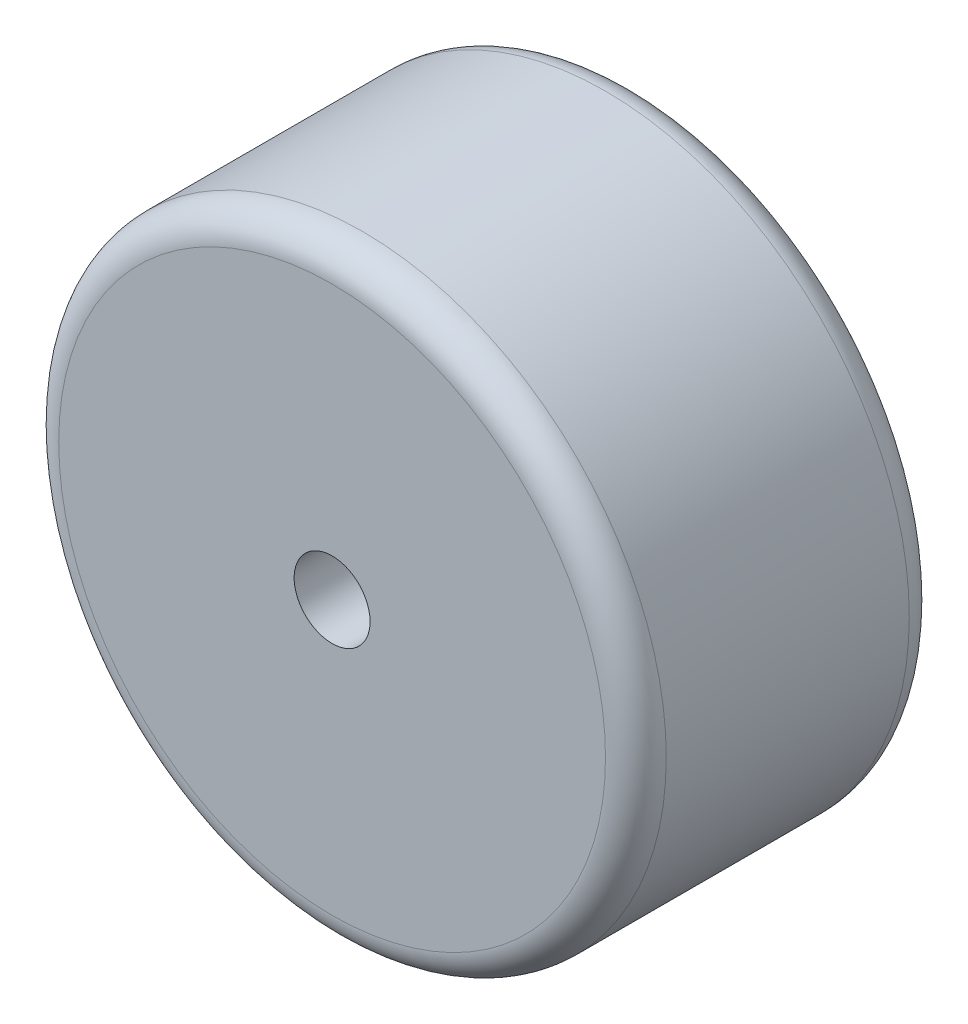
ISO-10303-21;
HEADER;
FILE_DESCRIPTION(('STEP AP214'),'2;1');
FILE_NAME('part.step','',(''),(''),'','','');
FILE_SCHEMA(('AUTOMOTIVE_DESIGN { 1 0 10303 214 1 1 1 1 }'));
ENDSEC;
DATA;
#1=APPLICATION_CONTEXT('core data for automotive mechanical design processes');
#2=APPLICATION_PROTOCOL_DEFINITION('international standard','automotive_design',2000,#1);
#3=PRODUCT_CONTEXT('',#1,'mechanical');
#4=PRODUCT('Part','Part','',(#3));
#5=PRODUCT_RELATED_PRODUCT_CATEGORY('part','',(#4));
#6=PRODUCT_DEFINITION_FORMATION('','',#4);
#7=PRODUCT_DEFINITION_CONTEXT('part definition',#1,'design');
#8=PRODUCT_DEFINITION('design','',#6,#7);
#9=PRODUCT_DEFINITION_SHAPE('','',#8);
#10=(LENGTH_UNIT() NAMED_UNIT(*) SI_UNIT(.MILLI.,.METRE.));
#11=(NAMED_UNIT(*) PLANE_ANGLE_UNIT() SI_UNIT($,.RADIAN.));
#12=(NAMED_UNIT(*) SI_UNIT($,.STERADIAN.) SOLID_ANGLE_UNIT());
#13=UNCERTAINTY_MEASURE_WITH_UNIT(LENGTH_MEASURE(1.E-05),#10,'distance_accuracy_value','');
#14=(GEOMETRIC_REPRESENTATION_CONTEXT(3) GLOBAL_UNCERTAINTY_ASSIGNED_CONTEXT((#13)) GLOBAL_UNIT_ASSIGNED_CONTEXT((#10,
#11,#12)) REPRESENTATION_CONTEXT('',''));
#15=CARTESIAN_POINT('',(0.,0.,0.));
#16=DIRECTION('',(0.,0.,1.));
#17=DIRECTION('',(1.,0.,0.));
#18=AXIS2_PLACEMENT_3D('',#15,#16,#17);
#19=CARTESIAN_POINT('',(0.,0.,25.4));
#20=DIRECTION('',(0.,0.,-1.));
#21=DIRECTION('',(-1.,0.,0.));
#22=AXIS2_PLACEMENT_3D('',#19,#20,#21);
#23=CYLINDRICAL_SURFACE('',#22,25.4);
#24=CARTESIAN_POINT('',(0.,0.,2.54));
#25=DIRECTION('',(0.,0.,1.));
#26=DIRECTION('',(1.,0.,0.));
#27=AXIS2_PLACEMENT_3D('',#24,#25,#26);
#28=CIRCLE('',#27,25.4);
#29=CARTESIAN_POINT('',(25.4,0.,2.54));
#30=VERTEX_POINT('',#29);
#31=EDGE_CURVE('E41',#30,#30,#28,.T.);
#32=ORIENTED_EDGE('',*,*,#31,.T.);
#33=EDGE_LOOP('',(#32));
#34=FACE_BOUND('',#33,.T.);
#35=CARTESIAN_POINT('',(0.,0.,22.86));
#36=DIRECTION('',(0.,0.,1.));
#37=DIRECTION('',(1.,0.,0.));
#38=AXIS2_PLACEMENT_3D('',#35,#36,#37);
#39=CIRCLE('',#38,25.4);
#40=CARTESIAN_POINT('',(25.4,0.,22.86));
#41=VERTEX_POINT('',#40);
#42=EDGE_CURVE('E45',#41,#41,#39,.F.);
#43=ORIENTED_EDGE('',*,*,#42,.T.);
#44=EDGE_LOOP('',(#43));
#45=FACE_BOUND('',#44,.T.);
#46=ADVANCED_FACE('F30',(#34,#45),#23,.T.);
#47=CARTESIAN_POINT('',(0.,0.,25.4));
#48=DIRECTION('',(0.,0.,1.));
#49=DIRECTION('',(1.,0.,0.));
#50=AXIS2_PLACEMENT_3D('',#47,#48,#49);
#51=PLANE('',#50);
#52=CARTESIAN_POINT('',(0.,0.,25.4));
#53=DIRECTION('',(0.,0.,1.));
#54=DIRECTION('',(1.,0.,0.));
#55=AXIS2_PLACEMENT_3D('',#52,#53,#54);
#56=CIRCLE('',#55,3.175);
#57=CARTESIAN_POINT('',(3.175,0.,25.4));
#58=VERTEX_POINT('',#57);
#59=EDGE_CURVE('E53',#58,#58,#56,.T.);
#60=ORIENTED_EDGE('',*,*,#59,.F.);
#61=EDGE_LOOP('',(#60));
#62=FACE_BOUND('',#61,.T.);
#63=CARTESIAN_POINT('',(0.,0.,25.4));
#64=DIRECTION('',(0.,0.,1.));
#65=DIRECTION('',(1.,0.,0.));
#66=AXIS2_PLACEMENT_3D('',#63,#64,#65);
#67=CIRCLE('',#66,22.86);
#68=CARTESIAN_POINT('',(22.86,0.,25.4));
#69=VERTEX_POINT('',#68);
#70=EDGE_CURVE('E10',#69,#69,#67,.T.);
#71=ORIENTED_EDGE('',*,*,#70,.T.);
#72=EDGE_LOOP('',(#71));
#73=FACE_BOUND('',#72,.T.);
#74=ADVANCED_FACE('F60',(#62,#73),#51,.T.);
#75=CARTESIAN_POINT('',(0.,0.,0.));
#76=DIRECTION('',(0.,0.,1.));
#77=DIRECTION('',(1.,0.,0.));
#78=AXIS2_PLACEMENT_3D('',#75,#76,#77);
#79=PLANE('',#78);
#80=CARTESIAN_POINT('',(0.,0.,0.));
#81=DIRECTION('',(0.,0.,1.));
#82=DIRECTION('',(1.,0.,0.));
#83=AXIS2_PLACEMENT_3D('',#80,#81,#82);
#84=CIRCLE('',#83,3.175);
#85=CARTESIAN_POINT('',(3.175,0.,0.));
#86=VERTEX_POINT('',#85);
#87=EDGE_CURVE('E50',#86,#86,#84,.F.);
#88=ORIENTED_EDGE('',*,*,#87,.F.);
#89=EDGE_LOOP('',(#88));
#90=FACE_BOUND('',#89,.T.);
#91=CARTESIAN_POINT('',(0.,0.,0.));
#92=DIRECTION('',(0.,0.,1.));
#93=DIRECTION('',(1.,0.,0.));
#94=AXIS2_PLACEMENT_3D('',#91,#92,#93);
#95=CIRCLE('',#94,22.86);
#96=CARTESIAN_POINT('',(22.86,0.,0.));
#97=VERTEX_POINT('',#96);
#98=EDGE_CURVE('E37',#97,#97,#95,.F.);
#99=ORIENTED_EDGE('',*,*,#98,.T.);
#100=EDGE_LOOP('',(#99));
#101=FACE_BOUND('',#100,.T.);
#102=ADVANCED_FACE('F62',(#90,#101),#79,.F.);
#103=CARTESIAN_POINT('',(0.,0.,2.54));
#104=DIRECTION('',(0.,0.,1.));
#105=DIRECTION('',(1.,0.,0.));
#106=AXIS2_PLACEMENT_3D('',#103,#104,#105);
#107=TOROIDAL_SURFACE('',#106,22.86,2.54);
#108=ORIENTED_EDGE('',*,*,#98,.F.);
#109=EDGE_LOOP('',(#108));
#110=FACE_BOUND('',#109,.T.);
#111=ORIENTED_EDGE('',*,*,#31,.F.);
#112=EDGE_LOOP('',(#111));
#113=FACE_BOUND('',#112,.T.);
#114=ADVANCED_FACE('F68',(#110,#113),#107,.T.);
#115=CARTESIAN_POINT('',(0.,0.,22.86));
#116=DIRECTION('',(0.,0.,1.));
#117=DIRECTION('',(1.,0.,0.));
#118=AXIS2_PLACEMENT_3D('',#115,#116,#117);
#119=TOROIDAL_SURFACE('',#118,22.86,2.54);
#120=ORIENTED_EDGE('',*,*,#42,.F.);
#121=EDGE_LOOP('',(#120));
#122=FACE_BOUND('',#121,.T.);
#123=ORIENTED_EDGE('',*,*,#70,.F.);
#124=EDGE_LOOP('',(#123));
#125=FACE_BOUND('',#124,.T.);
#126=ADVANCED_FACE('F32',(#122,#125),#119,.T.);
#127=CARTESIAN_POINT('',(0.,0.,-0.001000000000001));
#128=DIRECTION('',(0.,0.,1.));
#129=DIRECTION('',(1.,0.,0.));
#130=AXIS2_PLACEMENT_3D('',#127,#128,#129);
#131=CYLINDRICAL_SURFACE('',#130,3.175);
#132=CARTESIAN_POINT('',(3.175,0.,25.4));
#133=CARTESIAN_POINT('',(3.175,0.,25.1354166666667));
#134=CARTESIAN_POINT('',(3.175,0.,24.8708333333333));
#135=CARTESIAN_POINT('',(3.175,0.,24.3416666666667));
#136=CARTESIAN_POINT('',(3.175,0.,24.0770833333333));
#137=CARTESIAN_POINT('',(3.175,0.,23.5479166666667));
#138=CARTESIAN_POINT('',(3.175,0.,23.2833333333333));
#139=CARTESIAN_POINT('',(3.175,0.,22.7541666666667));
#140=CARTESIAN_POINT('',(3.175,0.,22.4895833333333));
#141=CARTESIAN_POINT('',(3.175,0.,21.9604166666667));
#142=CARTESIAN_POINT('',(3.175,0.,21.6958333333333));
#143=CARTESIAN_POINT('',(3.175,0.,21.1666666666667));
#144=CARTESIAN_POINT('',(3.175,0.,20.9020833333333));
#145=CARTESIAN_POINT('',(3.175,0.,20.3729166666667));
#146=CARTESIAN_POINT('',(3.175,0.,20.1083333333333));
#147=CARTESIAN_POINT('',(3.175,0.,19.5791666666667));
#148=CARTESIAN_POINT('',(3.175,0.,19.3145833333333));
#149=CARTESIAN_POINT('',(3.175,0.,18.7854166666667));
#150=CARTESIAN_POINT('',(3.175,0.,18.5208333333333));
#151=CARTESIAN_POINT('',(3.175,0.,17.9916666666667));
#152=CARTESIAN_POINT('',(3.175,0.,17.7270833333333));
#153=CARTESIAN_POINT('',(3.175,0.,17.1979166666667));
#154=CARTESIAN_POINT('',(3.175,0.,16.9333333333333));
#155=CARTESIAN_POINT('',(3.175,0.,16.4041666666667));
#156=CARTESIAN_POINT('',(3.175,0.,16.1395833333333));
#157=CARTESIAN_POINT('',(3.175,0.,15.6104166666667));
#158=CARTESIAN_POINT('',(3.175,0.,15.3458333333333));
#159=CARTESIAN_POINT('',(3.175,0.,14.8166666666667));
#160=CARTESIAN_POINT('',(3.175,0.,14.5520833333333));
#161=CARTESIAN_POINT('',(3.175,0.,14.0229166666667));
#162=CARTESIAN_POINT('',(3.175,0.,13.7583333333333));
#163=CARTESIAN_POINT('',(3.175,0.,13.2291666666667));
#164=CARTESIAN_POINT('',(3.175,0.,12.9645833333333));
#165=CARTESIAN_POINT('',(3.175,0.,12.4354166666667));
#166=CARTESIAN_POINT('',(3.175,0.,12.1708333333333));
#167=CARTESIAN_POINT('',(3.175,0.,11.6416666666667));
#168=CARTESIAN_POINT('',(3.175,0.,11.3770833333333));
#169=CARTESIAN_POINT('',(3.175,0.,10.8479166666667));
#170=CARTESIAN_POINT('',(3.175,0.,10.5833333333333));
#171=CARTESIAN_POINT('',(3.175,0.,10.0541666666667));
#172=CARTESIAN_POINT('',(3.175,0.,9.78958333333333));
#173=CARTESIAN_POINT('',(3.175,0.,9.26041666666666));
#174=CARTESIAN_POINT('',(3.175,0.,8.99583333333333));
#175=CARTESIAN_POINT('',(3.175,0.,8.46666666666666));
#176=CARTESIAN_POINT('',(3.175,0.,8.20208333333333));
#177=CARTESIAN_POINT('',(3.175,0.,7.67291666666667));
#178=CARTESIAN_POINT('',(3.175,0.,7.40833333333333));
#179=CARTESIAN_POINT('',(3.175,0.,6.87916666666667));
#180=CARTESIAN_POINT('',(3.175,0.,6.61458333333333));
#181=CARTESIAN_POINT('',(3.175,0.,6.08541666666667));
#182=CARTESIAN_POINT('',(3.175,0.,5.82083333333333));
#183=CARTESIAN_POINT('',(3.175,0.,5.29166666666667));
#184=CARTESIAN_POINT('',(3.175,0.,5.02708333333333));
#185=CARTESIAN_POINT('',(3.175,0.,4.49791666666667));
#186=CARTESIAN_POINT('',(3.175,0.,4.23333333333333));
#187=CARTESIAN_POINT('',(3.175,0.,3.70416666666667));
#188=CARTESIAN_POINT('',(3.175,0.,3.43958333333333));
#189=CARTESIAN_POINT('',(3.175,0.,2.91041666666667));
#190=CARTESIAN_POINT('',(3.175,0.,2.64583333333333));
#191=CARTESIAN_POINT('',(3.175,0.,2.11666666666667));
#192=CARTESIAN_POINT('',(3.175,0.,1.85208333333333));
#193=CARTESIAN_POINT('',(3.175,0.,1.32291666666667));
#194=CARTESIAN_POINT('',(3.175,0.,1.05833333333333));
#195=CARTESIAN_POINT('',(3.175,0.,0.529166666666666));
#196=CARTESIAN_POINT('',(3.175,0.,0.264583333333333));
#197=CARTESIAN_POINT('',(3.175,0.,0.));
#198=B_SPLINE_CURVE_WITH_KNOTS('',3,(#132,#133,#134,#135,#136,#137,#138,#139,#140,#141,#142,
#143,#144,#145,#146,#147,#148,#149,#150,#151,#152,#153,#154,#155,#156,#157,#158,#159,#160,#161,
#162,#163,#164,#165,#166,#167,#168,#169,#170,#171,#172,#173,#174,#175,#176,#177,#178,#179,#180,
#181,#182,#183,#184,#185,#186,#187,#188,#189,#190,#191,#192,#193,#194,#195,#196,#197),
.UNSPECIFIED.,.F.,.F.,(4,2,2,2,2,2,2,2,2,2,2,2,2,2,2,2,2,2,2,2,2,2,2,2,2,2,2,2,2,2,2,2,4),(0.,
0.793749999999999,1.5875,2.38125,3.175,3.96875,4.7625,5.55625,6.35,7.14375,7.9375,8.73125,9.525,
10.31875,11.1125,11.90625,12.7,13.49375,14.2875,15.08125,15.875,16.66875,17.4625,18.25625,19.05,
19.84375,20.6375,21.43125,22.225,23.01875,23.8125,24.60625,25.4),.UNSPECIFIED.);
#199=EDGE_CURVE('BSEAM57',#58,#86,#198,.T.);
#200=ORIENTED_EDGE('',*,*,#59,.T.);
#201=ORIENTED_EDGE('',*,*,#87,.T.);
#202=ORIENTED_EDGE('',*,*,#199,.T.);
#203=ORIENTED_EDGE('',*,*,#199,.F.);
#204=EDGE_LOOP('',(#200,#202,#201,#203));
#205=FACE_BOUND('',#204,.T.);
#206=ADVANCED_FACE('F57',(#205),#131,.F.);
#207=CLOSED_SHELL('',(#46,#74,#102,#114,#126,#206));
#208=MANIFOLD_SOLID_BREP('B2',#207);
#209=ADVANCED_BREP_SHAPE_REPRESENTATION('',(#18,#208),#14);
#210=SHAPE_DEFINITION_REPRESENTATION(#9,#209);
ENDSEC;
END-ISO-10303-21;
